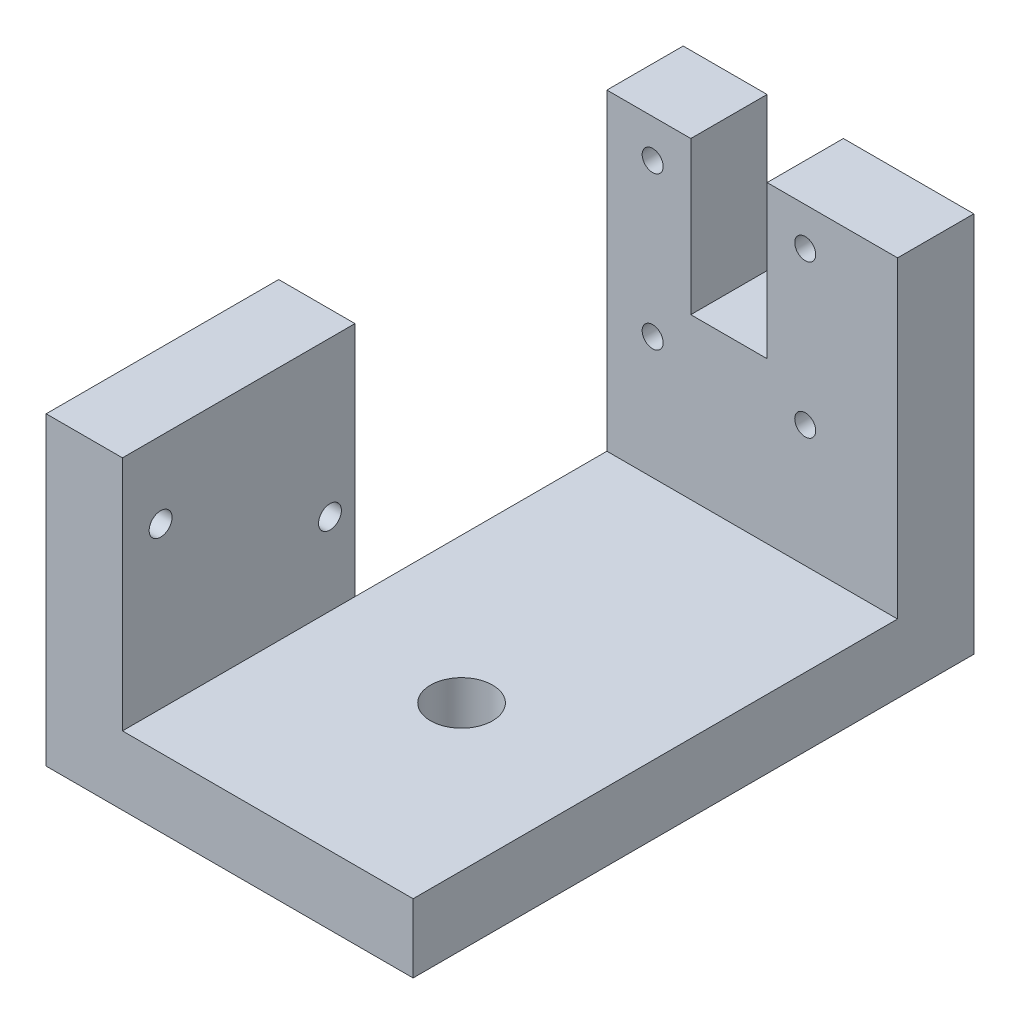
ISO-10303-21;
HEADER;
FILE_DESCRIPTION(('STEP AP214'),'2;1');
FILE_NAME('part.step','',(''),(''),'','','');
FILE_SCHEMA(('AUTOMOTIVE_DESIGN { 1 0 10303 214 1 1 1 1 }'));
ENDSEC;
DATA;
#1=APPLICATION_CONTEXT('core data for automotive mechanical design processes');
#2=APPLICATION_PROTOCOL_DEFINITION('international standard','automotive_design',2000,#1);
#3=PRODUCT_CONTEXT('',#1,'mechanical');
#4=PRODUCT('Part','Part','',(#3));
#5=PRODUCT_RELATED_PRODUCT_CATEGORY('part','',(#4));
#6=PRODUCT_DEFINITION_FORMATION('','',#4);
#7=PRODUCT_DEFINITION_CONTEXT('part definition',#1,'design');
#8=PRODUCT_DEFINITION('design','',#6,#7);
#9=PRODUCT_DEFINITION_SHAPE('','',#8);
#10=(LENGTH_UNIT() NAMED_UNIT(*) SI_UNIT(.MILLI.,.METRE.));
#11=(NAMED_UNIT(*) PLANE_ANGLE_UNIT() SI_UNIT($,.RADIAN.));
#12=(NAMED_UNIT(*) SI_UNIT($,.STERADIAN.) SOLID_ANGLE_UNIT());
#13=UNCERTAINTY_MEASURE_WITH_UNIT(LENGTH_MEASURE(1.E-05),#10,'distance_accuracy_value','');
#14=(GEOMETRIC_REPRESENTATION_CONTEXT(3) GLOBAL_UNCERTAINTY_ASSIGNED_CONTEXT((#13)) GLOBAL_UNIT_ASSIGNED_CONTEXT((#10,
#11,#12)) REPRESENTATION_CONTEXT('',''));
#15=CARTESIAN_POINT('',(0.,0.,0.));
#16=DIRECTION('',(0.,0.,1.));
#17=DIRECTION('',(1.,0.,0.));
#18=AXIS2_PLACEMENT_3D('',#15,#16,#17);
#19=CARTESIAN_POINT('',(-19.05,9.,0.));
#20=DIRECTION('',(1.,0.,0.));
#21=DIRECTION('',(0.,0.,-1.));
#22=AXIS2_PLACEMENT_3D('',#19,#20,#21);
#23=PLANE('',#22);
#24=DIRECTION('',(0.,-1.,0.));
#25=VECTOR('',#24,1.);
#26=CARTESIAN_POINT('',(-19.05,40.,1.27));
#27=LINE('',#26,#25);
#28=CARTESIAN_POINT('',(-19.05,9.,1.27));
#29=VERTEX_POINT('',#28);
#30=CARTESIAN_POINT('',(-19.05,0.,1.27));
#31=VERTEX_POINT('',#30);
#32=EDGE_CURVE('E12',#29,#31,#27,.T.);
#33=ORIENTED_EDGE('',*,*,#32,.F.);
#34=DIRECTION('',(0.,0.,1.));
#35=VECTOR('',#34,1.);
#36=CARTESIAN_POINT('',(-19.05,9.,0.));
#37=LINE('',#36,#35);
#38=CARTESIAN_POINT('',(-19.05,9.,-31.75));
#39=VERTEX_POINT('',#38);
#40=EDGE_CURVE('E281',#39,#29,#37,.T.);
#41=ORIENTED_EDGE('',*,*,#40,.F.);
#42=DIRECTION('',(0.,1.,0.));
#43=VECTOR('',#42,1.);
#44=CARTESIAN_POINT('',(-19.05,0.,-31.75));
#45=LINE('',#44,#43);
#46=CARTESIAN_POINT('',(-19.05,50.,-31.75));
#47=VERTEX_POINT('',#46);
#48=EDGE_CURVE('E227',#39,#47,#45,.T.);
#49=ORIENTED_EDGE('',*,*,#48,.T.);
#50=DIRECTION('',(0.,0.,1.));
#51=VECTOR('',#50,1.);
#52=CARTESIAN_POINT('',(-19.05,50.,-41.75));
#53=LINE('',#52,#51);
#54=CARTESIAN_POINT('',(-19.05,50.,-41.75));
#55=VERTEX_POINT('',#54);
#56=EDGE_CURVE('E231',#55,#47,#53,.T.);
#57=ORIENTED_EDGE('',*,*,#56,.F.);
#58=DIRECTION('',(0.,1.,0.));
#59=VECTOR('',#58,1.);
#60=CARTESIAN_POINT('',(-19.05,0.,-41.75));
#61=LINE('',#60,#59);
#62=CARTESIAN_POINT('',(-19.05,0.,-41.75));
#63=VERTEX_POINT('',#62);
#64=EDGE_CURVE('E200',#63,#55,#61,.T.);
#65=ORIENTED_EDGE('',*,*,#64,.F.);
#66=DIRECTION('',(0.,0.,1.));
#67=VECTOR('',#66,1.);
#68=CARTESIAN_POINT('',(-19.05,0.,0.));
#69=LINE('',#68,#67);
#70=EDGE_CURVE('E110',#63,#31,#69,.T.);
#71=ORIENTED_EDGE('',*,*,#70,.T.);
#72=EDGE_LOOP('',(#33,#41,#49,#57,#65,#71));
#73=FACE_BOUND('',#72,.T.);
#74=ADVANCED_FACE('F50',(#73),#23,.F.);
#75=CARTESIAN_POINT('',(0.,9.,31.75));
#76=DIRECTION('',(0.,0.,-1.));
#77=DIRECTION('',(-1.,0.,0.));
#78=AXIS2_PLACEMENT_3D('',#75,#76,#77);
#79=PLANE('',#78);
#80=DIRECTION('',(1.,0.,0.));
#81=VECTOR('',#80,1.);
#82=CARTESIAN_POINT('',(0.,0.,31.75));
#83=LINE('',#82,#81);
#84=CARTESIAN_POINT('',(-29.05,0.,31.75));
#85=VERTEX_POINT('',#84);
#86=CARTESIAN_POINT('',(19.05,0.,31.75));
#87=VERTEX_POINT('',#86);
#88=EDGE_CURVE('E277',#85,#87,#83,.T.);
#89=ORIENTED_EDGE('',*,*,#88,.T.);
#90=DIRECTION('',(0.,-1.,0.));
#91=VECTOR('',#90,1.);
#92=CARTESIAN_POINT('',(19.05,9.,31.75));
#93=LINE('',#92,#91);
#94=CARTESIAN_POINT('',(19.05,9.,31.75));
#95=VERTEX_POINT('',#94);
#96=EDGE_CURVE('E54',#95,#87,#93,.T.);
#97=ORIENTED_EDGE('',*,*,#96,.F.);
#98=DIRECTION('',(1.,0.,0.));
#99=VECTOR('',#98,1.);
#100=CARTESIAN_POINT('',(0.,9.,31.75));
#101=LINE('',#100,#99);
#102=CARTESIAN_POINT('',(-19.05,9.,31.75));
#103=VERTEX_POINT('',#102);
#104=EDGE_CURVE('E74',#103,#95,#101,.T.);
#105=ORIENTED_EDGE('',*,*,#104,.F.);
#106=DIRECTION('',(0.,-1.,0.));
#107=VECTOR('',#106,1.);
#108=CARTESIAN_POINT('',(-19.05,40.,31.75));
#109=LINE('',#108,#107);
#110=CARTESIAN_POINT('',(-19.05,40.,31.75));
#111=VERTEX_POINT('',#110);
#112=EDGE_CURVE('E266',#111,#103,#109,.T.);
#113=ORIENTED_EDGE('',*,*,#112,.F.);
#114=DIRECTION('',(-1.,0.,0.));
#115=VECTOR('',#114,1.);
#116=CARTESIAN_POINT('',(0.,40.,31.75));
#117=LINE('',#116,#115);
#118=CARTESIAN_POINT('',(-29.05,40.,31.75));
#119=VERTEX_POINT('',#118);
#120=EDGE_CURVE('E257',#111,#119,#117,.T.);
#121=ORIENTED_EDGE('',*,*,#120,.T.);
#122=DIRECTION('',(0.,-1.,0.));
#123=VECTOR('',#122,1.);
#124=CARTESIAN_POINT('',(-29.05,40.,31.75));
#125=LINE('',#124,#123);
#126=EDGE_CURVE('E269',#119,#85,#125,.T.);
#127=ORIENTED_EDGE('',*,*,#126,.T.);
#128=EDGE_LOOP('',(#89,#97,#105,#113,#121,#127));
#129=FACE_BOUND('',#128,.T.);
#130=ADVANCED_FACE('F287',(#129),#79,.F.);
#131=CARTESIAN_POINT('',(19.05,9.,0.));
#132=DIRECTION('',(1.,0.,0.));
#133=DIRECTION('',(0.,0.,-1.));
#134=AXIS2_PLACEMENT_3D('',#131,#132,#133);
#135=PLANE('',#134);
#136=DIRECTION('',(0.,0.,1.));
#137=VECTOR('',#136,1.);
#138=CARTESIAN_POINT('',(19.05,0.,0.));
#139=LINE('',#138,#137);
#140=CARTESIAN_POINT('',(19.05,0.,-41.75));
#141=VERTEX_POINT('',#140);
#142=EDGE_CURVE('E273',#141,#87,#139,.T.);
#143=ORIENTED_EDGE('',*,*,#142,.F.);
#144=DIRECTION('',(0.,1.,0.));
#145=VECTOR('',#144,1.);
#146=CARTESIAN_POINT('',(19.05,0.,-41.75));
#147=LINE('',#146,#145);
#148=CARTESIAN_POINT('',(19.05,50.,-41.75));
#149=VERTEX_POINT('',#148);
#150=EDGE_CURVE('E194',#141,#149,#147,.T.);
#151=ORIENTED_EDGE('',*,*,#150,.T.);
#152=DIRECTION('',(0.,0.,1.));
#153=VECTOR('',#152,1.);
#154=CARTESIAN_POINT('',(19.05,50.,-41.75));
#155=LINE('',#154,#153);
#156=CARTESIAN_POINT('',(19.05,50.,-31.75));
#157=VERTEX_POINT('',#156);
#158=EDGE_CURVE('E234',#149,#157,#155,.T.);
#159=ORIENTED_EDGE('',*,*,#158,.T.);
#160=DIRECTION('',(0.,1.,0.));
#161=VECTOR('',#160,1.);
#162=CARTESIAN_POINT('',(19.05,0.,-31.75));
#163=LINE('',#162,#161);
#164=CARTESIAN_POINT('',(19.05,9.,-31.75));
#165=VERTEX_POINT('',#164);
#166=EDGE_CURVE('E224',#165,#157,#163,.T.);
#167=ORIENTED_EDGE('',*,*,#166,.F.);
#168=DIRECTION('',(0.,0.,1.));
#169=VECTOR('',#168,1.);
#170=CARTESIAN_POINT('',(19.05,9.,0.));
#171=LINE('',#170,#169);
#172=EDGE_CURVE('E274',#165,#95,#171,.T.);
#173=ORIENTED_EDGE('',*,*,#172,.T.);
#174=ORIENTED_EDGE('',*,*,#96,.T.);
#175=EDGE_LOOP('',(#143,#151,#159,#167,#173,#174));
#176=FACE_BOUND('',#175,.T.);
#177=ADVANCED_FACE('F52',(#176),#135,.T.);
#178=CARTESIAN_POINT('',(0.,0.,0.));
#179=DIRECTION('',(0.,1.,0.));
#180=DIRECTION('',(0.,0.,1.));
#181=AXIS2_PLACEMENT_3D('',#178,#179,#180);
#182=PLANE('',#181);
#183=CARTESIAN_POINT('',(0.,0.,6.35));
#184=DIRECTION('',(0.,1.,0.));
#185=DIRECTION('',(0.,0.,1.));
#186=AXIS2_PLACEMENT_3D('',#183,#184,#185);
#187=CIRCLE('',#186,4.064);
#188=CARTESIAN_POINT('',(0.,0.,2.286));
#189=VERTEX_POINT('',#188);
#190=EDGE_CURVE('E417',#189,#189,#187,.T.);
#191=ORIENTED_EDGE('',*,*,#190,.T.);
#192=EDGE_LOOP('',(#191));
#193=FACE_BOUND('',#192,.T.);
#194=ORIENTED_EDGE('',*,*,#142,.T.);
#195=ORIENTED_EDGE('',*,*,#88,.F.);
#196=DIRECTION('',(0.,0.,1.));
#197=VECTOR('',#196,1.);
#198=CARTESIAN_POINT('',(-29.05,0.,0.));
#199=LINE('',#198,#197);
#200=CARTESIAN_POINT('',(-29.05,0.,1.27));
#201=VERTEX_POINT('',#200);
#202=EDGE_CURVE('E255',#201,#85,#199,.T.);
#203=ORIENTED_EDGE('',*,*,#202,.F.);
#204=DIRECTION('',(1.,0.,0.));
#205=VECTOR('',#204,1.);
#206=CARTESIAN_POINT('',(0.,0.,1.27000000000001));
#207=LINE('',#206,#205);
#208=EDGE_CURVE('E243',#201,#31,#207,.T.);
#209=ORIENTED_EDGE('',*,*,#208,.T.);
#210=ORIENTED_EDGE('',*,*,#70,.F.);
#211=DIRECTION('',(1.,0.,0.));
#212=VECTOR('',#211,1.);
#213=CARTESIAN_POINT('',(0.,0.,-41.75));
#214=LINE('',#213,#212);
#215=EDGE_CURVE('E197',#63,#141,#214,.T.);
#216=ORIENTED_EDGE('',*,*,#215,.T.);
#217=EDGE_LOOP('',(#194,#195,#203,#209,#210,#216));
#218=FACE_BOUND('',#217,.T.);
#219=ADVANCED_FACE('F291',(#193,#218),#182,.F.);
#220=CARTESIAN_POINT('',(0.,9.,0.));
#221=DIRECTION('',(0.,1.,0.));
#222=DIRECTION('',(0.,0.,1.));
#223=AXIS2_PLACEMENT_3D('',#220,#221,#222);
#224=PLANE('',#223);
#225=CARTESIAN_POINT('',(0.,9.,6.35));
#226=DIRECTION('',(0.,1.,0.));
#227=DIRECTION('',(0.,0.,1.));
#228=AXIS2_PLACEMENT_3D('',#225,#226,#227);
#229=CIRCLE('',#228,4.064);
#230=CARTESIAN_POINT('',(0.,9.,2.286));
#231=VERTEX_POINT('',#230);
#232=EDGE_CURVE('E206',#231,#231,#229,.T.);
#233=ORIENTED_EDGE('',*,*,#232,.F.);
#234=EDGE_LOOP('',(#233));
#235=FACE_BOUND('',#234,.T.);
#236=ORIENTED_EDGE('',*,*,#172,.F.);
#237=DIRECTION('',(1.,0.,0.));
#238=VECTOR('',#237,1.);
#239=CARTESIAN_POINT('',(0.,9.,-31.75));
#240=LINE('',#239,#238);
#241=EDGE_CURVE('E276',#39,#165,#240,.T.);
#242=ORIENTED_EDGE('',*,*,#241,.F.);
#243=ORIENTED_EDGE('',*,*,#40,.T.);
#244=EDGE_CURVE('E280',#29,#103,#37,.T.);
#245=ORIENTED_EDGE('',*,*,#244,.T.);
#246=ORIENTED_EDGE('',*,*,#104,.T.);
#247=EDGE_LOOP('',(#236,#242,#243,#245,#246));
#248=FACE_BOUND('',#247,.T.);
#249=ADVANCED_FACE('F306',(#235,#248),#224,.T.);
#250=CARTESIAN_POINT('',(-19.05,40.,0.));
#251=DIRECTION('',(1.,0.,0.));
#252=DIRECTION('',(0.,0.,-1.));
#253=AXIS2_PLACEMENT_3D('',#250,#251,#252);
#254=PLANE('',#253);
#255=CARTESIAN_POINT('',(-19.05,19.7,4.55));
#256=DIRECTION('',(-1.,0.,0.));
#257=DIRECTION('',(0.,0.,1.));
#258=AXIS2_PLACEMENT_3D('',#255,#256,#257);
#259=CIRCLE('',#258,1.5);
#260=CARTESIAN_POINT('',(-19.05,19.7,6.05));
#261=VERTEX_POINT('',#260);
#262=EDGE_CURVE('E240',#261,#261,#259,.T.);
#263=ORIENTED_EDGE('',*,*,#262,.T.);
#264=EDGE_LOOP('',(#263));
#265=FACE_BOUND('',#264,.T.);
#266=CARTESIAN_POINT('',(-19.05,30.,26.75));
#267=DIRECTION('',(-1.,0.,0.));
#268=DIRECTION('',(0.,0.,1.));
#269=AXIS2_PLACEMENT_3D('',#266,#267,#268);
#270=CIRCLE('',#269,1.5);
#271=CARTESIAN_POINT('',(-19.05,30.,28.25));
#272=VERTEX_POINT('',#271);
#273=EDGE_CURVE('E247',#272,#272,#270,.T.);
#274=ORIENTED_EDGE('',*,*,#273,.T.);
#275=EDGE_LOOP('',(#274));
#276=FACE_BOUND('',#275,.T.);
#277=ORIENTED_EDGE('',*,*,#244,.F.);
#278=CARTESIAN_POINT('',(-19.05,40.,1.27));
#279=VERTEX_POINT('',#278);
#280=EDGE_CURVE('E60',#279,#29,#27,.T.);
#281=ORIENTED_EDGE('',*,*,#280,.F.);
#282=DIRECTION('',(0.,0.,1.));
#283=VECTOR('',#282,1.);
#284=CARTESIAN_POINT('',(-19.05,40.,0.));
#285=LINE('',#284,#283);
#286=EDGE_CURVE('E260',#279,#111,#285,.T.);
#287=ORIENTED_EDGE('',*,*,#286,.T.);
#288=ORIENTED_EDGE('',*,*,#112,.T.);
#289=EDGE_LOOP('',(#277,#281,#287,#288));
#290=FACE_BOUND('',#289,.T.);
#291=ADVANCED_FACE('F307',(#265,#276,#290),#254,.T.);
#292=CARTESIAN_POINT('',(0.,40.,1.27000000000001));
#293=DIRECTION('',(0.,0.,-1.));
#294=DIRECTION('',(-1.,0.,0.));
#295=AXIS2_PLACEMENT_3D('',#292,#293,#294);
#296=PLANE('',#295);
#297=ORIENTED_EDGE('',*,*,#208,.F.);
#298=DIRECTION('',(0.,-1.,0.));
#299=VECTOR('',#298,1.);
#300=CARTESIAN_POINT('',(-29.05,40.,1.27));
#301=LINE('',#300,#299);
#302=CARTESIAN_POINT('',(-29.05,40.,1.27));
#303=VERTEX_POINT('',#302);
#304=EDGE_CURVE('E115',#303,#201,#301,.T.);
#305=ORIENTED_EDGE('',*,*,#304,.F.);
#306=DIRECTION('',(1.,0.,0.));
#307=VECTOR('',#306,1.);
#308=CARTESIAN_POINT('',(0.,40.,1.27000000000001));
#309=LINE('',#308,#307);
#310=EDGE_CURVE('E252',#303,#279,#309,.T.);
#311=ORIENTED_EDGE('',*,*,#310,.T.);
#312=ORIENTED_EDGE('',*,*,#280,.T.);
#313=ORIENTED_EDGE('',*,*,#32,.T.);
#314=EDGE_LOOP('',(#297,#305,#311,#312,#313));
#315=FACE_BOUND('',#314,.T.);
#316=ADVANCED_FACE('F308',(#315),#296,.T.);
#317=CARTESIAN_POINT('',(-29.05,40.,0.));
#318=DIRECTION('',(1.,0.,0.));
#319=DIRECTION('',(0.,0.,-1.));
#320=AXIS2_PLACEMENT_3D('',#317,#318,#319);
#321=PLANE('',#320);
#322=CARTESIAN_POINT('',(-29.05,19.7,4.55));
#323=DIRECTION('',(-1.,0.,0.));
#324=DIRECTION('',(0.,0.,1.));
#325=AXIS2_PLACEMENT_3D('',#322,#323,#324);
#326=CIRCLE('',#325,1.5);
#327=CARTESIAN_POINT('',(-29.05,19.7,6.05));
#328=VERTEX_POINT('',#327);
#329=EDGE_CURVE('E244',#328,#328,#326,.T.);
#330=ORIENTED_EDGE('',*,*,#329,.F.);
#331=EDGE_LOOP('',(#330));
#332=FACE_BOUND('',#331,.T.);
#333=CARTESIAN_POINT('',(-29.05,30.,26.75));
#334=DIRECTION('',(-1.,0.,0.));
#335=DIRECTION('',(0.,0.,1.));
#336=AXIS2_PLACEMENT_3D('',#333,#334,#335);
#337=CIRCLE('',#336,1.5);
#338=CARTESIAN_POINT('',(-29.05,30.,28.25));
#339=VERTEX_POINT('',#338);
#340=EDGE_CURVE('E172',#339,#339,#337,.T.);
#341=ORIENTED_EDGE('',*,*,#340,.F.);
#342=EDGE_LOOP('',(#341));
#343=FACE_BOUND('',#342,.T.);
#344=ORIENTED_EDGE('',*,*,#202,.T.);
#345=ORIENTED_EDGE('',*,*,#126,.F.);
#346=DIRECTION('',(0.,0.,1.));
#347=VECTOR('',#346,1.);
#348=CARTESIAN_POINT('',(-29.05,40.,0.));
#349=LINE('',#348,#347);
#350=EDGE_CURVE('E254',#303,#119,#349,.T.);
#351=ORIENTED_EDGE('',*,*,#350,.F.);
#352=ORIENTED_EDGE('',*,*,#304,.T.);
#353=EDGE_LOOP('',(#344,#345,#351,#352));
#354=FACE_BOUND('',#353,.T.);
#355=ADVANCED_FACE('F315',(#332,#343,#354),#321,.F.);
#356=CARTESIAN_POINT('',(0.,40.,0.));
#357=DIRECTION('',(0.,1.,0.));
#358=DIRECTION('',(0.,0.,1.));
#359=AXIS2_PLACEMENT_3D('',#356,#357,#358);
#360=PLANE('',#359);
#361=ORIENTED_EDGE('',*,*,#310,.F.);
#362=ORIENTED_EDGE('',*,*,#350,.T.);
#363=ORIENTED_EDGE('',*,*,#120,.F.);
#364=ORIENTED_EDGE('',*,*,#286,.F.);
#365=EDGE_LOOP('',(#361,#362,#363,#364));
#366=FACE_BOUND('',#365,.T.);
#367=ADVANCED_FACE('F313',(#366),#360,.T.);
#368=CARTESIAN_POINT('',(-19.05,30.,26.75));
#369=DIRECTION('',(-1.,0.,0.));
#370=DIRECTION('',(0.,0.,1.));
#371=AXIS2_PLACEMENT_3D('',#368,#369,#370);
#372=CYLINDRICAL_SURFACE('',#371,1.5);
#373=ORIENTED_EDGE('',*,*,#273,.F.);
#374=EDGE_LOOP('',(#373));
#375=FACE_BOUND('',#374,.T.);
#376=ORIENTED_EDGE('',*,*,#340,.T.);
#377=EDGE_LOOP('',(#376));
#378=FACE_BOUND('',#377,.T.);
#379=ADVANCED_FACE('F354',(#375,#378),#372,.F.);
#380=CARTESIAN_POINT('',(-19.05,19.7,4.55));
#381=DIRECTION('',(-1.,0.,0.));
#382=DIRECTION('',(0.,0.,1.));
#383=AXIS2_PLACEMENT_3D('',#380,#381,#382);
#384=CYLINDRICAL_SURFACE('',#383,1.5);
#385=ORIENTED_EDGE('',*,*,#262,.F.);
#386=EDGE_LOOP('',(#385));
#387=FACE_BOUND('',#386,.T.);
#388=ORIENTED_EDGE('',*,*,#329,.T.);
#389=EDGE_LOOP('',(#388));
#390=FACE_BOUND('',#389,.T.);
#391=ADVANCED_FACE('F357',(#387,#390),#384,.F.);
#392=CARTESIAN_POINT('',(0.,0.,-31.75));
#393=DIRECTION('',(0.,0.,-1.));
#394=DIRECTION('',(-1.,0.,0.));
#395=AXIS2_PLACEMENT_3D('',#392,#393,#394);
#396=PLANE('',#395);
#397=CARTESIAN_POINT('',(-13.05,25.,-31.75));
#398=DIRECTION('',(0.,0.,-1.));
#399=DIRECTION('',(-1.,0.,0.));
#400=AXIS2_PLACEMENT_3D('',#397,#398,#399);
#401=CIRCLE('',#400,1.375);
#402=CARTESIAN_POINT('',(-14.425,25.,-31.75));
#403=VERTEX_POINT('',#402);
#404=EDGE_CURVE('E202',#403,#403,#401,.T.);
#405=ORIENTED_EDGE('',*,*,#404,.T.);
#406=EDGE_LOOP('',(#405));
#407=FACE_BOUND('',#406,.T.);
#408=CARTESIAN_POINT('',(6.95000000000001,25.,-31.75));
#409=DIRECTION('',(0.,0.,-1.));
#410=DIRECTION('',(-1.,0.,0.));
#411=AXIS2_PLACEMENT_3D('',#408,#409,#410);
#412=CIRCLE('',#411,1.375);
#413=CARTESIAN_POINT('',(5.57500000000001,25.,-31.75));
#414=VERTEX_POINT('',#413);
#415=EDGE_CURVE('E205',#414,#414,#412,.T.);
#416=ORIENTED_EDGE('',*,*,#415,.T.);
#417=EDGE_LOOP('',(#416));
#418=FACE_BOUND('',#417,.T.);
#419=CARTESIAN_POINT('',(-13.05,45.,-31.75));
#420=DIRECTION('',(0.,0.,-1.));
#421=DIRECTION('',(-1.,0.,0.));
#422=AXIS2_PLACEMENT_3D('',#419,#420,#421);
#423=CIRCLE('',#422,1.375);
#424=CARTESIAN_POINT('',(-14.425,45.,-31.75));
#425=VERTEX_POINT('',#424);
#426=EDGE_CURVE('E209',#425,#425,#423,.T.);
#427=ORIENTED_EDGE('',*,*,#426,.T.);
#428=EDGE_LOOP('',(#427));
#429=FACE_BOUND('',#428,.T.);
#430=CARTESIAN_POINT('',(6.95000000000001,45.,-31.75));
#431=DIRECTION('',(0.,0.,-1.));
#432=DIRECTION('',(-1.,0.,0.));
#433=AXIS2_PLACEMENT_3D('',#430,#431,#432);
#434=CIRCLE('',#433,1.375);
#435=CARTESIAN_POINT('',(5.57500000000001,45.,-31.75));
#436=VERTEX_POINT('',#435);
#437=EDGE_CURVE('E212',#436,#436,#434,.T.);
#438=ORIENTED_EDGE('',*,*,#437,.T.);
#439=EDGE_LOOP('',(#438));
#440=FACE_BOUND('',#439,.T.);
#441=ORIENTED_EDGE('',*,*,#48,.F.);
#442=ORIENTED_EDGE('',*,*,#241,.T.);
#443=ORIENTED_EDGE('',*,*,#166,.T.);
#444=DIRECTION('',(1.,0.,0.));
#445=VECTOR('',#444,1.);
#446=CARTESIAN_POINT('',(0.,50.,-31.75));
#447=LINE('',#446,#445);
#448=CARTESIAN_POINT('',(1.95000000000001,50.,-31.75));
#449=VERTEX_POINT('',#448);
#450=EDGE_CURVE('E221',#449,#157,#447,.T.);
#451=ORIENTED_EDGE('',*,*,#450,.F.);
#452=DIRECTION('',(0.,-1.,0.));
#453=VECTOR('',#452,1.);
#454=CARTESIAN_POINT('',(1.95,0.,-31.75));
#455=LINE('',#454,#453);
#456=CARTESIAN_POINT('',(1.95000000000001,30.,-31.75));
#457=VERTEX_POINT('',#456);
#458=EDGE_CURVE('E218',#449,#457,#455,.T.);
#459=ORIENTED_EDGE('',*,*,#458,.T.);
#460=DIRECTION('',(-1.,0.,0.));
#461=VECTOR('',#460,1.);
#462=CARTESIAN_POINT('',(0.,30.,-31.75));
#463=LINE('',#462,#461);
#464=CARTESIAN_POINT('',(-8.04999999999999,30.,-31.75));
#465=VERTEX_POINT('',#464);
#466=EDGE_CURVE('E216',#457,#465,#463,.T.);
#467=ORIENTED_EDGE('',*,*,#466,.T.);
#468=DIRECTION('',(0.,1.,0.));
#469=VECTOR('',#468,1.);
#470=CARTESIAN_POINT('',(-8.04999999999999,0.,-31.75));
#471=LINE('',#470,#469);
#472=CARTESIAN_POINT('',(-8.04999999999999,50.,-31.75));
#473=VERTEX_POINT('',#472);
#474=EDGE_CURVE('E167',#465,#473,#471,.T.);
#475=ORIENTED_EDGE('',*,*,#474,.T.);
#476=EDGE_CURVE('E225',#47,#473,#447,.T.);
#477=ORIENTED_EDGE('',*,*,#476,.F.);
#478=EDGE_LOOP('',(#441,#442,#443,#451,#459,#467,#475,#477));
#479=FACE_BOUND('',#478,.T.);
#480=ADVANCED_FACE('F302',(#407,#418,#429,#440,#479),#396,.F.);
#481=CARTESIAN_POINT('',(-8.04999999999999,0.,-41.75));
#482=DIRECTION('',(1.,0.,0.));
#483=DIRECTION('',(0.,0.,-1.));
#484=AXIS2_PLACEMENT_3D('',#481,#482,#483);
#485=PLANE('',#484);
#486=ORIENTED_EDGE('',*,*,#474,.F.);
#487=DIRECTION('',(0.,0.,1.));
#488=VECTOR('',#487,1.);
#489=CARTESIAN_POINT('',(-8.04999999999999,30.,-41.75));
#490=LINE('',#489,#488);
#491=CARTESIAN_POINT('',(-8.04999999999999,30.,-41.75));
#492=VERTEX_POINT('',#491);
#493=EDGE_CURVE('E162',#492,#465,#490,.T.);
#494=ORIENTED_EDGE('',*,*,#493,.F.);
#495=DIRECTION('',(0.,1.,0.));
#496=VECTOR('',#495,1.);
#497=CARTESIAN_POINT('',(-8.04999999999999,0.,-41.75));
#498=LINE('',#497,#496);
#499=CARTESIAN_POINT('',(-8.04999999999999,50.,-41.75));
#500=VERTEX_POINT('',#499);
#501=EDGE_CURVE('E165',#492,#500,#498,.T.);
#502=ORIENTED_EDGE('',*,*,#501,.T.);
#503=DIRECTION('',(0.,0.,1.));
#504=VECTOR('',#503,1.);
#505=CARTESIAN_POINT('',(-8.04999999999999,50.,-41.75));
#506=LINE('',#505,#504);
#507=EDGE_CURVE('E229',#500,#473,#506,.T.);
#508=ORIENTED_EDGE('',*,*,#507,.T.);
#509=EDGE_LOOP('',(#486,#494,#502,#508));
#510=FACE_BOUND('',#509,.T.);
#511=ADVANCED_FACE('F164',(#510),#485,.T.);
#512=CARTESIAN_POINT('',(0.,30.,-41.75));
#513=DIRECTION('',(0.,1.,0.));
#514=DIRECTION('',(0.,0.,1.));
#515=AXIS2_PLACEMENT_3D('',#512,#513,#514);
#516=PLANE('',#515);
#517=ORIENTED_EDGE('',*,*,#466,.F.);
#518=DIRECTION('',(0.,0.,1.));
#519=VECTOR('',#518,1.);
#520=CARTESIAN_POINT('',(1.95000000000001,30.,-41.75));
#521=LINE('',#520,#519);
#522=CARTESIAN_POINT('',(1.95000000000001,30.,-41.75));
#523=VERTEX_POINT('',#522);
#524=EDGE_CURVE('E173',#523,#457,#521,.T.);
#525=ORIENTED_EDGE('',*,*,#524,.F.);
#526=DIRECTION('',(-1.,0.,0.));
#527=VECTOR('',#526,1.);
#528=CARTESIAN_POINT('',(0.,30.,-41.75));
#529=LINE('',#528,#527);
#530=EDGE_CURVE('E179',#523,#492,#529,.T.);
#531=ORIENTED_EDGE('',*,*,#530,.T.);
#532=ORIENTED_EDGE('',*,*,#493,.T.);
#533=EDGE_LOOP('',(#517,#525,#531,#532));
#534=FACE_BOUND('',#533,.T.);
#535=ADVANCED_FACE('F186',(#534),#516,.T.);
#536=CARTESIAN_POINT('',(1.95,0.,-41.75));
#537=DIRECTION('',(-1.,0.,0.));
#538=DIRECTION('',(0.,-1.,0.));
#539=AXIS2_PLACEMENT_3D('',#536,#537,#538);
#540=PLANE('',#539);
#541=ORIENTED_EDGE('',*,*,#458,.F.);
#542=DIRECTION('',(0.,0.,1.));
#543=VECTOR('',#542,1.);
#544=CARTESIAN_POINT('',(1.95000000000001,50.,-41.75));
#545=LINE('',#544,#543);
#546=CARTESIAN_POINT('',(1.95000000000001,50.,-41.75));
#547=VERTEX_POINT('',#546);
#548=EDGE_CURVE('E237',#547,#449,#545,.T.);
#549=ORIENTED_EDGE('',*,*,#548,.F.);
#550=DIRECTION('',(0.,-1.,0.));
#551=VECTOR('',#550,1.);
#552=CARTESIAN_POINT('',(1.95,0.,-41.75));
#553=LINE('',#552,#551);
#554=EDGE_CURVE('E187',#547,#523,#553,.T.);
#555=ORIENTED_EDGE('',*,*,#554,.T.);
#556=ORIENTED_EDGE('',*,*,#524,.T.);
#557=EDGE_LOOP('',(#541,#549,#555,#556));
#558=FACE_BOUND('',#557,.T.);
#559=ADVANCED_FACE('F322',(#558),#540,.T.);
#560=CARTESIAN_POINT('',(0.,50.,-41.75));
#561=DIRECTION('',(0.,-1.,0.));
#562=DIRECTION('',(1.,0.,0.));
#563=AXIS2_PLACEMENT_3D('',#560,#561,#562);
#564=PLANE('',#563);
#565=ORIENTED_EDGE('',*,*,#450,.T.);
#566=ORIENTED_EDGE('',*,*,#158,.F.);
#567=DIRECTION('',(1.,0.,0.));
#568=VECTOR('',#567,1.);
#569=CARTESIAN_POINT('',(0.,50.,-41.75));
#570=LINE('',#569,#568);
#571=EDGE_CURVE('E189',#547,#149,#570,.T.);
#572=ORIENTED_EDGE('',*,*,#571,.F.);
#573=ORIENTED_EDGE('',*,*,#548,.T.);
#574=EDGE_LOOP('',(#565,#566,#572,#573));
#575=FACE_BOUND('',#574,.T.);
#576=ADVANCED_FACE('F297',(#575),#564,.F.);
#577=CARTESIAN_POINT('',(6.95000000000001,45.,-41.75));
#578=DIRECTION('',(0.,0.,1.));
#579=DIRECTION('',(1.,0.,0.));
#580=AXIS2_PLACEMENT_3D('',#577,#578,#579);
#581=CYLINDRICAL_SURFACE('',#580,1.375);
#582=CARTESIAN_POINT('',(6.95000000000001,45.,-41.75));
#583=DIRECTION('',(0.,0.,-1.));
#584=DIRECTION('',(-1.,0.,0.));
#585=AXIS2_PLACEMENT_3D('',#582,#583,#584);
#586=CIRCLE('',#585,1.375);
#587=CARTESIAN_POINT('',(5.57500000000001,45.,-41.75));
#588=VERTEX_POINT('',#587);
#589=EDGE_CURVE('E184',#588,#588,#586,.T.);
#590=ORIENTED_EDGE('',*,*,#589,.T.);
#591=EDGE_LOOP('',(#590));
#592=FACE_BOUND('',#591,.T.);
#593=ORIENTED_EDGE('',*,*,#437,.F.);
#594=EDGE_LOOP('',(#593));
#595=FACE_BOUND('',#594,.T.);
#596=ADVANCED_FACE('F329',(#592,#595),#581,.F.);
#597=CARTESIAN_POINT('',(-13.05,45.,-41.75));
#598=DIRECTION('',(0.,0.,1.));
#599=DIRECTION('',(1.,0.,0.));
#600=AXIS2_PLACEMENT_3D('',#597,#598,#599);
#601=CYLINDRICAL_SURFACE('',#600,1.375);
#602=CARTESIAN_POINT('',(-13.05,45.,-41.75));
#603=DIRECTION('',(0.,0.,-1.));
#604=DIRECTION('',(-1.,0.,0.));
#605=AXIS2_PLACEMENT_3D('',#602,#603,#604);
#606=CIRCLE('',#605,1.375);
#607=CARTESIAN_POINT('',(-14.425,45.,-41.75));
#608=VERTEX_POINT('',#607);
#609=EDGE_CURVE('E408',#608,#608,#606,.T.);
#610=ORIENTED_EDGE('',*,*,#609,.T.);
#611=EDGE_LOOP('',(#610));
#612=FACE_BOUND('',#611,.T.);
#613=ORIENTED_EDGE('',*,*,#426,.F.);
#614=EDGE_LOOP('',(#613));
#615=FACE_BOUND('',#614,.T.);
#616=ADVANCED_FACE('F369',(#612,#615),#601,.F.);
#617=CARTESIAN_POINT('',(6.95000000000001,25.,-41.75));
#618=DIRECTION('',(0.,0.,1.));
#619=DIRECTION('',(1.,0.,0.));
#620=AXIS2_PLACEMENT_3D('',#617,#618,#619);
#621=CYLINDRICAL_SURFACE('',#620,1.375);
#622=CARTESIAN_POINT('',(6.95000000000001,25.,-41.75));
#623=DIRECTION('',(0.,0.,-1.));
#624=DIRECTION('',(-1.,0.,0.));
#625=AXIS2_PLACEMENT_3D('',#622,#623,#624);
#626=CIRCLE('',#625,1.375);
#627=CARTESIAN_POINT('',(5.57500000000001,25.,-41.75));
#628=VERTEX_POINT('',#627);
#629=EDGE_CURVE('E404',#628,#628,#626,.T.);
#630=ORIENTED_EDGE('',*,*,#629,.T.);
#631=EDGE_LOOP('',(#630));
#632=FACE_BOUND('',#631,.T.);
#633=ORIENTED_EDGE('',*,*,#415,.F.);
#634=EDGE_LOOP('',(#633));
#635=FACE_BOUND('',#634,.T.);
#636=ADVANCED_FACE('F365',(#632,#635),#621,.F.);
#637=CARTESIAN_POINT('',(-13.05,25.,-41.75));
#638=DIRECTION('',(0.,0.,1.));
#639=DIRECTION('',(1.,0.,0.));
#640=AXIS2_PLACEMENT_3D('',#637,#638,#639);
#641=CYLINDRICAL_SURFACE('',#640,1.375);
#642=CARTESIAN_POINT('',(-13.05,25.,-41.75));
#643=DIRECTION('',(0.,0.,-1.));
#644=DIRECTION('',(-1.,0.,0.));
#645=AXIS2_PLACEMENT_3D('',#642,#643,#644);
#646=CIRCLE('',#645,1.375);
#647=CARTESIAN_POINT('',(-14.425,25.,-41.75));
#648=VERTEX_POINT('',#647);
#649=EDGE_CURVE('E320',#648,#648,#646,.T.);
#650=ORIENTED_EDGE('',*,*,#649,.T.);
#651=EDGE_LOOP('',(#650));
#652=FACE_BOUND('',#651,.T.);
#653=ORIENTED_EDGE('',*,*,#404,.F.);
#654=EDGE_LOOP('',(#653));
#655=FACE_BOUND('',#654,.T.);
#656=ADVANCED_FACE('F362',(#652,#655),#641,.F.);
#657=ORIENTED_EDGE('',*,*,#476,.T.);
#658=ORIENTED_EDGE('',*,*,#507,.F.);
#659=EDGE_CURVE('E182',#55,#500,#570,.T.);
#660=ORIENTED_EDGE('',*,*,#659,.F.);
#661=ORIENTED_EDGE('',*,*,#56,.T.);
#662=EDGE_LOOP('',(#657,#658,#660,#661));
#663=FACE_BOUND('',#662,.T.);
#664=ADVANCED_FACE('F319',(#663),#564,.F.);
#665=CARTESIAN_POINT('',(0.,0.,-41.75));
#666=DIRECTION('',(0.,0.,-1.));
#667=DIRECTION('',(-1.,0.,0.));
#668=AXIS2_PLACEMENT_3D('',#665,#666,#667);
#669=PLANE('',#668);
#670=ORIENTED_EDGE('',*,*,#649,.F.);
#671=EDGE_LOOP('',(#670));
#672=FACE_BOUND('',#671,.T.);
#673=ORIENTED_EDGE('',*,*,#629,.F.);
#674=EDGE_LOOP('',(#673));
#675=FACE_BOUND('',#674,.T.);
#676=ORIENTED_EDGE('',*,*,#609,.F.);
#677=EDGE_LOOP('',(#676));
#678=FACE_BOUND('',#677,.T.);
#679=ORIENTED_EDGE('',*,*,#589,.F.);
#680=EDGE_LOOP('',(#679));
#681=FACE_BOUND('',#680,.T.);
#682=ORIENTED_EDGE('',*,*,#501,.F.);
#683=ORIENTED_EDGE('',*,*,#530,.F.);
#684=ORIENTED_EDGE('',*,*,#554,.F.);
#685=ORIENTED_EDGE('',*,*,#571,.T.);
#686=ORIENTED_EDGE('',*,*,#150,.F.);
#687=ORIENTED_EDGE('',*,*,#215,.F.);
#688=ORIENTED_EDGE('',*,*,#64,.T.);
#689=ORIENTED_EDGE('',*,*,#659,.T.);
#690=EDGE_LOOP('',(#682,#683,#684,#685,#686,#687,#688,#689));
#691=FACE_BOUND('',#690,.T.);
#692=ADVANCED_FACE('F177',(#672,#675,#678,#681,#691),#669,.T.);
#693=CARTESIAN_POINT('',(0.,20.4947278349685,6.35));
#694=DIRECTION('',(0.,-1.,0.));
#695=DIRECTION('',(0.,0.,-1.));
#696=AXIS2_PLACEMENT_3D('',#693,#694,#695);
#697=CYLINDRICAL_SURFACE('',#696,4.064);
#698=CARTESIAN_POINT('',(0.,0.,2.286));
#699=CARTESIAN_POINT('',(0.,0.0937499999999966,2.286));
#700=CARTESIAN_POINT('',(0.,0.187499999999997,2.286));
#701=CARTESIAN_POINT('',(0.,0.374999999999997,2.286));
#702=CARTESIAN_POINT('',(0.,0.468749999999997,2.286));
#703=CARTESIAN_POINT('',(0.,0.656249999999997,2.286));
#704=CARTESIAN_POINT('',(0.,0.749999999999997,2.286));
#705=CARTESIAN_POINT('',(0.,0.937499999999997,2.286));
#706=CARTESIAN_POINT('',(0.,1.03125,2.286));
#707=CARTESIAN_POINT('',(0.,1.21875,2.286));
#708=CARTESIAN_POINT('',(0.,1.3125,2.286));
#709=CARTESIAN_POINT('',(0.,1.5,2.286));
#710=CARTESIAN_POINT('',(0.,1.59375,2.286));
#711=CARTESIAN_POINT('',(0.,1.78125,2.286));
#712=CARTESIAN_POINT('',(0.,1.875,2.286));
#713=CARTESIAN_POINT('',(0.,2.0625,2.286));
#714=CARTESIAN_POINT('',(0.,2.15625,2.286));
#715=CARTESIAN_POINT('',(0.,2.34375,2.286));
#716=CARTESIAN_POINT('',(0.,2.4375,2.286));
#717=CARTESIAN_POINT('',(0.,2.625,2.286));
#718=CARTESIAN_POINT('',(0.,2.71875,2.286));
#719=CARTESIAN_POINT('',(0.,2.90625,2.286));
#720=CARTESIAN_POINT('',(0.,3.,2.286));
#721=CARTESIAN_POINT('',(0.,3.1875,2.286));
#722=CARTESIAN_POINT('',(0.,3.28125,2.286));
#723=CARTESIAN_POINT('',(0.,3.46875,2.286));
#724=CARTESIAN_POINT('',(0.,3.5625,2.286));
#725=CARTESIAN_POINT('',(0.,3.75,2.286));
#726=CARTESIAN_POINT('',(0.,3.84375,2.286));
#727=CARTESIAN_POINT('',(0.,4.03125,2.286));
#728=CARTESIAN_POINT('',(0.,4.125,2.286));
#729=CARTESIAN_POINT('',(0.,4.3125,2.286));
#730=CARTESIAN_POINT('',(0.,4.40625,2.286));
#731=CARTESIAN_POINT('',(0.,4.59375,2.286));
#732=CARTESIAN_POINT('',(0.,4.6875,2.286));
#733=CARTESIAN_POINT('',(0.,4.875,2.286));
#734=CARTESIAN_POINT('',(0.,4.96875,2.286));
#735=CARTESIAN_POINT('',(0.,5.15625,2.286));
#736=CARTESIAN_POINT('',(0.,5.25,2.286));
#737=CARTESIAN_POINT('',(0.,5.4375,2.286));
#738=CARTESIAN_POINT('',(0.,5.53125,2.286));
#739=CARTESIAN_POINT('',(0.,5.71875,2.286));
#740=CARTESIAN_POINT('',(0.,5.8125,2.286));
#741=CARTESIAN_POINT('',(0.,6.,2.286));
#742=CARTESIAN_POINT('',(0.,6.09375,2.286));
#743=CARTESIAN_POINT('',(0.,6.28125,2.286));
#744=CARTESIAN_POINT('',(0.,6.375,2.286));
#745=CARTESIAN_POINT('',(0.,6.5625,2.286));
#746=CARTESIAN_POINT('',(0.,6.65625,2.286));
#747=CARTESIAN_POINT('',(0.,6.84375,2.286));
#748=CARTESIAN_POINT('',(0.,6.9375,2.286));
#749=CARTESIAN_POINT('',(0.,7.125,2.286));
#750=CARTESIAN_POINT('',(0.,7.21875,2.286));
#751=CARTESIAN_POINT('',(0.,7.40625,2.286));
#752=CARTESIAN_POINT('',(0.,7.5,2.286));
#753=CARTESIAN_POINT('',(0.,7.6875,2.286));
#754=CARTESIAN_POINT('',(0.,7.78125,2.286));
#755=CARTESIAN_POINT('',(0.,7.96875,2.286));
#756=CARTESIAN_POINT('',(0.,8.0625,2.286));
#757=CARTESIAN_POINT('',(0.,8.25,2.286));
#758=CARTESIAN_POINT('',(0.,8.34375,2.286));
#759=CARTESIAN_POINT('',(0.,8.53125,2.286));
#760=CARTESIAN_POINT('',(0.,8.625,2.286));
#761=CARTESIAN_POINT('',(0.,8.8125,2.286));
#762=CARTESIAN_POINT('',(0.,8.90625,2.286));
#763=CARTESIAN_POINT('',(0.,9.,2.286));
#764=B_SPLINE_CURVE_WITH_KNOTS('',3,(#698,#699,#700,#701,#702,#703,#704,#705,#706,#707,#708,
#709,#710,#711,#712,#713,#714,#715,#716,#717,#718,#719,#720,#721,#722,#723,#724,#725,#726,#727,
#728,#729,#730,#731,#732,#733,#734,#735,#736,#737,#738,#739,#740,#741,#742,#743,#744,#745,#746,
#747,#748,#749,#750,#751,#752,#753,#754,#755,#756,#757,#758,#759,#760,#761,#762,#763),
.UNSPECIFIED.,.F.,.F.,(4,2,2,2,2,2,2,2,2,2,2,2,2,2,2,2,2,2,2,2,2,2,2,2,2,2,2,2,2,2,2,2,4),(0.,
0.28125,0.5625,0.843750000000001,1.125,1.40625,1.6875,1.96875,2.25,2.53125,2.8125,3.09375,3.375,
3.65625,3.9375,4.21875,4.5,4.78125,5.0625,5.34375,5.625,5.90625,6.1875,6.46875,6.75,7.03125,
7.3125,7.59375,7.875,8.15625,8.4375,8.71875,9.),.UNSPECIFIED.);
#765=EDGE_CURVE('BSEAM392',#189,#231,#764,.T.);
#766=ORIENTED_EDGE('',*,*,#190,.F.);
#767=ORIENTED_EDGE('',*,*,#232,.T.);
#768=ORIENTED_EDGE('',*,*,#765,.T.);
#769=ORIENTED_EDGE('',*,*,#765,.F.);
#770=EDGE_LOOP('',(#766,#768,#767,#769));
#771=FACE_BOUND('',#770,.T.);
#772=ADVANCED_FACE('F392',(#771),#697,.F.);
#773=CLOSED_SHELL('',(#74,#130,#177,#219,#249,#291,#316,#355,#367,#379,#391,#480,#511,#535,#559,
#576,#596,#616,#636,#656,#664,#692,#772));
#774=MANIFOLD_SOLID_BREP('B2',#773);
#775=ADVANCED_BREP_SHAPE_REPRESENTATION('',(#18,#774),#14);
#776=SHAPE_DEFINITION_REPRESENTATION(#9,#775);
ENDSEC;
END-ISO-10303-21;
